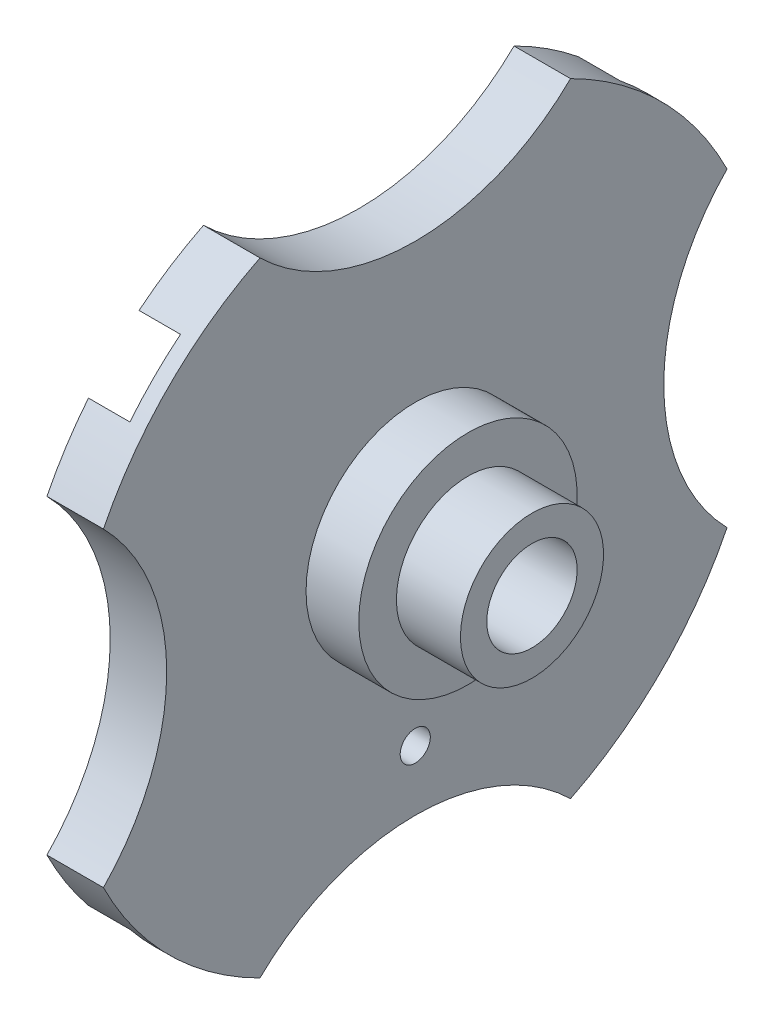
ISO-10303-21;
HEADER;
FILE_DESCRIPTION(('STEP AP214'),'2;1');
FILE_NAME('part.step','',(''),(''),'','','');
FILE_SCHEMA(('AUTOMOTIVE_DESIGN { 1 0 10303 214 1 1 1 1 }'));
ENDSEC;
DATA;
#1=APPLICATION_CONTEXT('core data for automotive mechanical design processes');
#2=APPLICATION_PROTOCOL_DEFINITION('international standard','automotive_design',2000,#1);
#3=PRODUCT_CONTEXT('',#1,'mechanical');
#4=PRODUCT('Part','Part','',(#3));
#5=PRODUCT_RELATED_PRODUCT_CATEGORY('part','',(#4));
#6=PRODUCT_DEFINITION_FORMATION('','',#4);
#7=PRODUCT_DEFINITION_CONTEXT('part definition',#1,'design');
#8=PRODUCT_DEFINITION('design','',#6,#7);
#9=PRODUCT_DEFINITION_SHAPE('','',#8);
#10=(LENGTH_UNIT() NAMED_UNIT(*) SI_UNIT(.MILLI.,.METRE.));
#11=(NAMED_UNIT(*) PLANE_ANGLE_UNIT() SI_UNIT($,.RADIAN.));
#12=(NAMED_UNIT(*) SI_UNIT($,.STERADIAN.) SOLID_ANGLE_UNIT());
#13=UNCERTAINTY_MEASURE_WITH_UNIT(LENGTH_MEASURE(1.E-05),#10,'distance_accuracy_value','');
#14=(GEOMETRIC_REPRESENTATION_CONTEXT(3) GLOBAL_UNCERTAINTY_ASSIGNED_CONTEXT((#13)) GLOBAL_UNIT_ASSIGNED_CONTEXT((#10,
#11,#12)) REPRESENTATION_CONTEXT('',''));
#15=CARTESIAN_POINT('',(0.,0.,0.));
#16=DIRECTION('',(0.,0.,1.));
#17=DIRECTION('',(1.,0.,0.));
#18=AXIS2_PLACEMENT_3D('',#15,#16,#17);
#19=CARTESIAN_POINT('',(0.,0.,0.));
#20=DIRECTION('',(-1.,0.,0.));
#21=DIRECTION('',(0.,0.,1.));
#22=AXIS2_PLACEMENT_3D('',#19,#20,#21);
#23=CYLINDRICAL_SURFACE('',#22,92.5);
#24=CARTESIAN_POINT('',(11.,0.,0.));
#25=DIRECTION('',(-1.,0.,0.));
#26=DIRECTION('',(0.,0.,1.));
#27=AXIS2_PLACEMENT_3D('',#24,#25,#26);
#28=CIRCLE('',#27,92.5);
#29=CARTESIAN_POINT('',(11.,-58.3439949371823,-71.779023779723));
#30=VERTEX_POINT('',#29);
#31=CARTESIAN_POINT('',(11.,-71.7790237797263,-58.3439949371783));
#32=VERTEX_POINT('',#31);
#33=EDGE_CURVE('E200',#30,#32,#28,.T.);
#34=ORIENTED_EDGE('',*,*,#33,.F.);
#35=DIRECTION('',(-1.,0.,0.));
#36=VECTOR('',#35,1.);
#37=CARTESIAN_POINT('',(0.,-58.3439949371823,-71.779023779723));
#38=LINE('',#37,#36);
#39=CARTESIAN_POINT('',(0.,-58.3439949371823,-71.779023779723));
#40=VERTEX_POINT('',#39);
#41=EDGE_CURVE('E251',#30,#40,#38,.T.);
#42=ORIENTED_EDGE('',*,*,#41,.T.);
#43=CARTESIAN_POINT('',(0.,0.,0.));
#44=DIRECTION('',(-1.,0.,0.));
#45=DIRECTION('',(0.,0.,1.));
#46=AXIS2_PLACEMENT_3D('',#43,#44,#45);
#47=CIRCLE('',#46,92.5);
#48=CARTESIAN_POINT('',(0.,-41.2340199228735,-82.8010000000004));
#49=VERTEX_POINT('',#48);
#50=EDGE_CURVE('E408',#49,#40,#47,.T.);
#51=ORIENTED_EDGE('',*,*,#50,.F.);
#52=DIRECTION('',(-1.,0.,0.));
#53=VECTOR('',#52,1.);
#54=CARTESIAN_POINT('',(23.,-41.2340199228735,-82.8010000000004));
#55=LINE('',#54,#53);
#56=CARTESIAN_POINT('',(15.,-41.2340199228735,-82.8010000000004));
#57=VERTEX_POINT('',#56);
#58=EDGE_CURVE('E313',#49,#57,#55,.F.);
#59=ORIENTED_EDGE('',*,*,#58,.T.);
#60=CARTESIAN_POINT('',(15.,0.,0.));
#61=DIRECTION('',(-1.,0.,0.));
#62=DIRECTION('',(0.,0.,1.));
#63=AXIS2_PLACEMENT_3D('',#60,#61,#62);
#64=CIRCLE('',#63,92.5);
#65=CARTESIAN_POINT('',(15.,-82.8009999999997,-41.2340199228749));
#66=VERTEX_POINT('',#65);
#67=EDGE_CURVE('E386',#57,#66,#64,.T.);
#68=ORIENTED_EDGE('',*,*,#67,.T.);
#69=DIRECTION('',(-1.,0.,0.));
#70=VECTOR('',#69,1.);
#71=CARTESIAN_POINT('',(23.,-82.8009999999997,-41.2340199228749));
#72=LINE('',#71,#70);
#73=CARTESIAN_POINT('',(0.,-82.8009999999997,-41.2340199228749));
#74=VERTEX_POINT('',#73);
#75=EDGE_CURVE('E322',#66,#74,#72,.T.);
#76=ORIENTED_EDGE('',*,*,#75,.T.);
#77=CARTESIAN_POINT('',(0.,-71.7790237797263,-58.3439949371783));
#78=VERTEX_POINT('',#77);
#79=EDGE_CURVE('E405',#78,#74,#47,.T.);
#80=ORIENTED_EDGE('',*,*,#79,.F.);
#81=DIRECTION('',(-1.,0.,0.));
#82=VECTOR('',#81,1.);
#83=CARTESIAN_POINT('',(0.,-71.7790237797263,-58.3439949371783));
#84=LINE('',#83,#82);
#85=EDGE_CURVE('E56',#78,#32,#84,.F.);
#86=ORIENTED_EDGE('',*,*,#85,.T.);
#87=EDGE_LOOP('',(#34,#42,#51,#59,#68,#76,#80,#86));
#88=FACE_BOUND('',#87,.T.);
#89=ADVANCED_FACE('F33',(#88),#23,.T.);
#90=CARTESIAN_POINT('',(11.,0.,0.));
#91=DIRECTION('',(-1.,0.,0.));
#92=DIRECTION('',(0.,0.,1.));
#93=AXIS2_PLACEMENT_3D('',#90,#91,#92);
#94=CIRCLE('',#93,92.5);
#95=CARTESIAN_POINT('',(11.,-71.7803426631613,58.3423723134323));
#96=VERTEX_POINT('',#95);
#97=CARTESIAN_POINT('',(11.,-58.3456175273266,71.7777048626864));
#98=VERTEX_POINT('',#97);
#99=EDGE_CURVE('E392',#96,#98,#94,.T.);
#100=ORIENTED_EDGE('',*,*,#99,.F.);
#101=DIRECTION('',(-1.,0.,0.));
#102=VECTOR('',#101,1.);
#103=CARTESIAN_POINT('',(0.,-71.7803426631613,58.3423723134323));
#104=LINE('',#103,#102);
#105=CARTESIAN_POINT('',(0.,-71.7803426631613,58.3423723134323));
#106=VERTEX_POINT('',#105);
#107=EDGE_CURVE('E275',#96,#106,#104,.T.);
#108=ORIENTED_EDGE('',*,*,#107,.T.);
#109=CARTESIAN_POINT('',(0.,-82.8010000000003,41.2340199228738));
#110=VERTEX_POINT('',#109);
#111=EDGE_CURVE('E409',#110,#106,#47,.T.);
#112=ORIENTED_EDGE('',*,*,#111,.F.);
#113=DIRECTION('',(-1.,0.,0.));
#114=VECTOR('',#113,1.);
#115=CARTESIAN_POINT('',(23.,-82.8010000000003,41.2340199228738));
#116=LINE('',#115,#114);
#117=CARTESIAN_POINT('',(15.,-82.8010000000003,41.2340199228738));
#118=VERTEX_POINT('',#117);
#119=EDGE_CURVE('E325',#110,#118,#116,.F.);
#120=ORIENTED_EDGE('',*,*,#119,.T.);
#121=CARTESIAN_POINT('',(15.,-41.2340199228747,82.8009999999998));
#122=VERTEX_POINT('',#121);
#123=EDGE_CURVE('E480',#118,#122,#64,.T.);
#124=ORIENTED_EDGE('',*,*,#123,.T.);
#125=DIRECTION('',(-1.,0.,0.));
#126=VECTOR('',#125,1.);
#127=CARTESIAN_POINT('',(23.,-41.2340199228747,82.8009999999998));
#128=LINE('',#127,#126);
#129=CARTESIAN_POINT('',(0.,-41.2340199228747,82.8009999999998));
#130=VERTEX_POINT('',#129);
#131=EDGE_CURVE('E334',#122,#130,#128,.T.);
#132=ORIENTED_EDGE('',*,*,#131,.T.);
#133=CARTESIAN_POINT('',(0.,-58.3456175273266,71.7777048626864));
#134=VERTEX_POINT('',#133);
#135=EDGE_CURVE('E410',#134,#130,#47,.T.);
#136=ORIENTED_EDGE('',*,*,#135,.F.);
#137=DIRECTION('',(-1.,0.,0.));
#138=VECTOR('',#137,1.);
#139=CARTESIAN_POINT('',(0.,-58.3456175273266,71.7777048626864));
#140=LINE('',#139,#138);
#141=EDGE_CURVE('E270',#134,#98,#140,.F.);
#142=ORIENTED_EDGE('',*,*,#141,.T.);
#143=EDGE_LOOP('',(#100,#108,#112,#120,#124,#132,#136,#142));
#144=FACE_BOUND('',#143,.T.);
#145=ADVANCED_FACE('F445',(#144),#23,.T.);
#146=CARTESIAN_POINT('',(11.,0.,0.));
#147=DIRECTION('',(-1.,0.,0.));
#148=DIRECTION('',(0.,0.,1.));
#149=AXIS2_PLACEMENT_3D('',#146,#147,#148);
#150=CIRCLE('',#149,92.5);
#151=CARTESIAN_POINT('',(11.,58.3439949371803,71.7790237797247));
#152=VERTEX_POINT('',#151);
#153=CARTESIAN_POINT('',(11.,71.7790237797247,58.3439949371803));
#154=VERTEX_POINT('',#153);
#155=EDGE_CURVE('E286',#152,#154,#150,.T.);
#156=ORIENTED_EDGE('',*,*,#155,.F.);
#157=DIRECTION('',(-1.,0.,0.));
#158=VECTOR('',#157,1.);
#159=CARTESIAN_POINT('',(11.,58.3439949371803,71.7790237797247));
#160=LINE('',#159,#158);
#161=CARTESIAN_POINT('',(0.,58.3439949371803,71.7790237797247));
#162=VERTEX_POINT('',#161);
#163=EDGE_CURVE('E299',#152,#162,#160,.T.);
#164=ORIENTED_EDGE('',*,*,#163,.T.);
#165=CARTESIAN_POINT('',(0.,41.2340199228741,82.8010000000001));
#166=VERTEX_POINT('',#165);
#167=EDGE_CURVE('E357',#166,#162,#47,.T.);
#168=ORIENTED_EDGE('',*,*,#167,.F.);
#169=DIRECTION('',(-1.,0.,0.));
#170=VECTOR('',#169,1.);
#171=CARTESIAN_POINT('',(23.,41.2340199228741,82.8010000000001));
#172=LINE('',#171,#170);
#173=CARTESIAN_POINT('',(15.,41.2340199228741,82.8010000000001));
#174=VERTEX_POINT('',#173);
#175=EDGE_CURVE('E337',#166,#174,#172,.F.);
#176=ORIENTED_EDGE('',*,*,#175,.T.);
#177=CARTESIAN_POINT('',(15.,82.801,41.2340199228744));
#178=VERTEX_POINT('',#177);
#179=EDGE_CURVE('E381',#174,#178,#64,.T.);
#180=ORIENTED_EDGE('',*,*,#179,.T.);
#181=DIRECTION('',(-1.,0.,0.));
#182=VECTOR('',#181,1.);
#183=CARTESIAN_POINT('',(23.,82.801,41.2340199228744));
#184=LINE('',#183,#182);
#185=CARTESIAN_POINT('',(0.,82.801,41.2340199228744));
#186=VERTEX_POINT('',#185);
#187=EDGE_CURVE('E346',#178,#186,#184,.T.);
#188=ORIENTED_EDGE('',*,*,#187,.T.);
#189=CARTESIAN_POINT('',(0.,71.7790237797247,58.3439949371803));
#190=VERTEX_POINT('',#189);
#191=EDGE_CURVE('E352',#190,#186,#47,.T.);
#192=ORIENTED_EDGE('',*,*,#191,.F.);
#193=DIRECTION('',(-1.,0.,0.));
#194=VECTOR('',#193,1.);
#195=CARTESIAN_POINT('',(11.,71.7790237797247,58.3439949371803));
#196=LINE('',#195,#194);
#197=EDGE_CURVE('E298',#154,#190,#196,.T.);
#198=ORIENTED_EDGE('',*,*,#197,.F.);
#199=EDGE_LOOP('',(#156,#164,#168,#176,#180,#188,#192,#198));
#200=FACE_BOUND('',#199,.T.);
#201=ADVANCED_FACE('F449',(#200),#23,.T.);
#202=CARTESIAN_POINT('',(11.,0.,0.));
#203=DIRECTION('',(-1.,0.,0.));
#204=DIRECTION('',(0.,0.,1.));
#205=AXIS2_PLACEMENT_3D('',#202,#203,#204);
#206=CIRCLE('',#205,92.5);
#207=CARTESIAN_POINT('',(11.,71.7777048626852,-58.3456175273282));
#208=VERTEX_POINT('',#207);
#209=CARTESIAN_POINT('',(11.,58.3423723134308,-71.7803426631625));
#210=VERTEX_POINT('',#209);
#211=EDGE_CURVE('E11',#208,#210,#206,.T.);
#212=ORIENTED_EDGE('',*,*,#211,.F.);
#213=DIRECTION('',(-1.,0.,0.));
#214=VECTOR('',#213,1.);
#215=CARTESIAN_POINT('',(0.,71.7777048626852,-58.3456175273282));
#216=LINE('',#215,#214);
#217=CARTESIAN_POINT('',(0.,71.7777048626852,-58.3456175273281));
#218=VERTEX_POINT('',#217);
#219=EDGE_CURVE('E229',#208,#218,#216,.T.);
#220=ORIENTED_EDGE('',*,*,#219,.T.);
#221=CARTESIAN_POINT('',(0.,82.801,-41.2340199228744));
#222=VERTEX_POINT('',#221);
#223=EDGE_CURVE('E353',#222,#218,#47,.T.);
#224=ORIENTED_EDGE('',*,*,#223,.F.);
#225=DIRECTION('',(-1.,0.,0.));
#226=VECTOR('',#225,1.);
#227=CARTESIAN_POINT('',(23.,82.801,-41.2340199228744));
#228=LINE('',#227,#226);
#229=CARTESIAN_POINT('',(15.,82.801,-41.2340199228744));
#230=VERTEX_POINT('',#229);
#231=EDGE_CURVE('E349',#222,#230,#228,.F.);
#232=ORIENTED_EDGE('',*,*,#231,.T.);
#233=CARTESIAN_POINT('',(15.,41.2340199228752,-82.8009999999996));
#234=VERTEX_POINT('',#233);
#235=EDGE_CURVE('E382',#230,#234,#64,.T.);
#236=ORIENTED_EDGE('',*,*,#235,.T.);
#237=DIRECTION('',(-1.,0.,0.));
#238=VECTOR('',#237,1.);
#239=CARTESIAN_POINT('',(23.,41.2340199228752,-82.8009999999996));
#240=LINE('',#239,#238);
#241=CARTESIAN_POINT('',(0.,41.2340199228752,-82.8009999999996));
#242=VERTEX_POINT('',#241);
#243=EDGE_CURVE('E310',#234,#242,#240,.T.);
#244=ORIENTED_EDGE('',*,*,#243,.T.);
#245=CARTESIAN_POINT('',(0.,58.3423723134308,-71.7803426631625));
#246=VERTEX_POINT('',#245);
#247=EDGE_CURVE('E356',#246,#242,#47,.T.);
#248=ORIENTED_EDGE('',*,*,#247,.F.);
#249=DIRECTION('',(-1.,0.,0.));
#250=VECTOR('',#249,1.);
#251=CARTESIAN_POINT('',(0.,58.3423723134308,-71.7803426631625));
#252=LINE('',#251,#250);
#253=EDGE_CURVE('E48',#246,#210,#252,.F.);
#254=ORIENTED_EDGE('',*,*,#253,.T.);
#255=EDGE_LOOP('',(#212,#220,#224,#232,#236,#244,#248,#254));
#256=FACE_BOUND('',#255,.T.);
#257=ADVANCED_FACE('F35',(#256),#23,.T.);
#258=CARTESIAN_POINT('',(15.,92.5,0.));
#259=DIRECTION('',(-1.,0.,0.));
#260=DIRECTION('',(0.,0.,1.));
#261=AXIS2_PLACEMENT_3D('',#258,#259,#260);
#262=PLANE('',#261);
#263=CARTESIAN_POINT('',(15.,-50.,0.));
#264=DIRECTION('',(-1.,0.,0.));
#265=DIRECTION('',(0.,0.,1.));
#266=AXIS2_PLACEMENT_3D('',#263,#264,#265);
#267=CIRCLE('',#266,4.00000000000001);
#268=CARTESIAN_POINT('',(15.,-50.,4.00000000000001));
#269=VERTEX_POINT('',#268);
#270=EDGE_CURVE('E214',#269,#269,#267,.T.);
#271=ORIENTED_EDGE('',*,*,#270,.T.);
#272=EDGE_LOOP('',(#271));
#273=FACE_BOUND('',#272,.T.);
#274=ORIENTED_EDGE('',*,*,#67,.F.);
#275=CARTESIAN_POINT('',(15.,1.30930626041602E-12,-125.));
#276=DIRECTION('',(-1.,0.,0.));
#277=DIRECTION('',(0.,0.,1.));
#278=AXIS2_PLACEMENT_3D('',#275,#276,#277);
#279=CIRCLE('',#278,59.);
#280=EDGE_CURVE('E302',#57,#234,#279,.T.);
#281=ORIENTED_EDGE('',*,*,#280,.T.);
#282=ORIENTED_EDGE('',*,*,#235,.F.);
#283=CARTESIAN_POINT('',(15.,125.,0.));
#284=DIRECTION('',(-1.,0.,0.));
#285=DIRECTION('',(0.,0.,1.));
#286=AXIS2_PLACEMENT_3D('',#283,#284,#285);
#287=CIRCLE('',#286,59.);
#288=EDGE_CURVE('E343',#230,#178,#287,.T.);
#289=ORIENTED_EDGE('',*,*,#288,.T.);
#290=ORIENTED_EDGE('',*,*,#179,.F.);
#291=CARTESIAN_POINT('',(15.,-4.36435420138673E-13,125.));
#292=DIRECTION('',(-1.,0.,0.));
#293=DIRECTION('',(0.,0.,1.));
#294=AXIS2_PLACEMENT_3D('',#291,#292,#293);
#295=CIRCLE('',#294,59.);
#296=EDGE_CURVE('E331',#174,#122,#295,.T.);
#297=ORIENTED_EDGE('',*,*,#296,.T.);
#298=ORIENTED_EDGE('',*,*,#123,.F.);
#299=CARTESIAN_POINT('',(15.,-125.,-8.72870840277346E-13));
#300=DIRECTION('',(-1.,0.,0.));
#301=DIRECTION('',(0.,0.,1.));
#302=AXIS2_PLACEMENT_3D('',#299,#300,#301);
#303=CIRCLE('',#302,59.);
#304=EDGE_CURVE('E319',#118,#66,#303,.T.);
#305=ORIENTED_EDGE('',*,*,#304,.T.);
#306=EDGE_LOOP('',(#274,#281,#282,#289,#290,#297,#298,#305));
#307=FACE_BOUND('',#306,.T.);
#308=CARTESIAN_POINT('',(15.,0.,0.));
#309=DIRECTION('',(-1.,0.,0.));
#310=DIRECTION('',(0.,0.,1.));
#311=AXIS2_PLACEMENT_3D('',#308,#309,#310);
#312=CIRCLE('',#311,29.);
#313=CARTESIAN_POINT('',(15.,0.,29.));
#314=VERTEX_POINT('',#313);
#315=EDGE_CURVE('E378',#314,#314,#312,.T.);
#316=ORIENTED_EDGE('',*,*,#315,.T.);
#317=EDGE_LOOP('',(#316));
#318=FACE_BOUND('',#317,.T.);
#319=ADVANCED_FACE('F423',(#273,#307,#318),#262,.F.);
#320=CARTESIAN_POINT('',(0.,0.,0.));
#321=DIRECTION('',(-1.,0.,0.));
#322=DIRECTION('',(0.,0.,1.));
#323=AXIS2_PLACEMENT_3D('',#320,#321,#322);
#324=CYLINDRICAL_SURFACE('',#323,29.);
#325=ORIENTED_EDGE('',*,*,#315,.F.);
#326=EDGE_LOOP('',(#325));
#327=FACE_BOUND('',#326,.T.);
#328=CARTESIAN_POINT('',(29.,0.,0.));
#329=DIRECTION('',(-1.,0.,0.));
#330=DIRECTION('',(0.,0.,1.));
#331=AXIS2_PLACEMENT_3D('',#328,#329,#330);
#332=CIRCLE('',#331,29.);
#333=CARTESIAN_POINT('',(29.,0.,29.));
#334=VERTEX_POINT('',#333);
#335=EDGE_CURVE('E375',#334,#334,#332,.T.);
#336=ORIENTED_EDGE('',*,*,#335,.T.);
#337=EDGE_LOOP('',(#336));
#338=FACE_BOUND('',#337,.T.);
#339=ADVANCED_FACE('F456',(#327,#338),#324,.T.);
#340=CARTESIAN_POINT('',(29.,29.,0.));
#341=DIRECTION('',(-1.,0.,0.));
#342=DIRECTION('',(0.,0.,1.));
#343=AXIS2_PLACEMENT_3D('',#340,#341,#342);
#344=PLANE('',#343);
#345=ORIENTED_EDGE('',*,*,#335,.F.);
#346=EDGE_LOOP('',(#345));
#347=FACE_BOUND('',#346,.T.);
#348=CARTESIAN_POINT('',(29.,0.,0.));
#349=DIRECTION('',(-1.,0.,0.));
#350=DIRECTION('',(0.,0.,1.));
#351=AXIS2_PLACEMENT_3D('',#348,#349,#350);
#352=CIRCLE('',#351,19.);
#353=CARTESIAN_POINT('',(29.,0.,19.));
#354=VERTEX_POINT('',#353);
#355=EDGE_CURVE('E372',#354,#354,#352,.T.);
#356=ORIENTED_EDGE('',*,*,#355,.T.);
#357=EDGE_LOOP('',(#356));
#358=FACE_BOUND('',#357,.T.);
#359=ADVANCED_FACE('F522',(#347,#358),#344,.F.);
#360=CARTESIAN_POINT('',(0.,0.,0.));
#361=DIRECTION('',(-1.,0.,0.));
#362=DIRECTION('',(0.,0.,1.));
#363=AXIS2_PLACEMENT_3D('',#360,#361,#362);
#364=CYLINDRICAL_SURFACE('',#363,19.);
#365=ORIENTED_EDGE('',*,*,#355,.F.);
#366=EDGE_LOOP('',(#365));
#367=FACE_BOUND('',#366,.T.);
#368=CARTESIAN_POINT('',(46.,0.,0.));
#369=DIRECTION('',(-1.,0.,0.));
#370=DIRECTION('',(0.,0.,1.));
#371=AXIS2_PLACEMENT_3D('',#368,#369,#370);
#372=CIRCLE('',#371,19.);
#373=CARTESIAN_POINT('',(46.,0.,19.));
#374=VERTEX_POINT('',#373);
#375=EDGE_CURVE('E369',#374,#374,#372,.T.);
#376=ORIENTED_EDGE('',*,*,#375,.T.);
#377=EDGE_LOOP('',(#376));
#378=FACE_BOUND('',#377,.T.);
#379=ADVANCED_FACE('F518',(#367,#378),#364,.T.);
#380=CARTESIAN_POINT('',(46.,19.,0.));
#381=DIRECTION('',(-1.,0.,0.));
#382=DIRECTION('',(0.,0.,1.));
#383=AXIS2_PLACEMENT_3D('',#380,#381,#382);
#384=PLANE('',#383);
#385=ORIENTED_EDGE('',*,*,#375,.F.);
#386=EDGE_LOOP('',(#385));
#387=FACE_BOUND('',#386,.T.);
#388=CARTESIAN_POINT('',(46.,0.,0.));
#389=DIRECTION('',(-1.,0.,0.));
#390=DIRECTION('',(0.,0.,1.));
#391=AXIS2_PLACEMENT_3D('',#388,#389,#390);
#392=CIRCLE('',#391,12.);
#393=CARTESIAN_POINT('',(46.,0.,12.));
#394=VERTEX_POINT('',#393);
#395=EDGE_CURVE('E366',#394,#394,#392,.T.);
#396=ORIENTED_EDGE('',*,*,#395,.T.);
#397=EDGE_LOOP('',(#396));
#398=FACE_BOUND('',#397,.T.);
#399=ADVANCED_FACE('F514',(#387,#398),#384,.F.);
#400=CARTESIAN_POINT('',(0.,0.,0.));
#401=DIRECTION('',(-1.,0.,0.));
#402=DIRECTION('',(0.,0.,1.));
#403=AXIS2_PLACEMENT_3D('',#400,#401,#402);
#404=CYLINDRICAL_SURFACE('',#403,12.);
#405=ORIENTED_EDGE('',*,*,#395,.F.);
#406=EDGE_LOOP('',(#405));
#407=FACE_BOUND('',#406,.T.);
#408=CARTESIAN_POINT('',(17.,0.,0.));
#409=DIRECTION('',(-1.,0.,0.));
#410=DIRECTION('',(0.,0.,1.));
#411=AXIS2_PLACEMENT_3D('',#408,#409,#410);
#412=CIRCLE('',#411,12.);
#413=CARTESIAN_POINT('',(17.,0.,12.));
#414=VERTEX_POINT('',#413);
#415=EDGE_CURVE('E363',#414,#414,#412,.T.);
#416=ORIENTED_EDGE('',*,*,#415,.T.);
#417=EDGE_LOOP('',(#416));
#418=FACE_BOUND('',#417,.T.);
#419=ADVANCED_FACE('F510',(#407,#418),#404,.F.);
#420=CARTESIAN_POINT('',(17.,24.,0.));
#421=DIRECTION('',(1.,0.,0.));
#422=DIRECTION('',(0.,0.,-1.));
#423=AXIS2_PLACEMENT_3D('',#420,#421,#422);
#424=PLANE('',#423);
#425=ORIENTED_EDGE('',*,*,#415,.F.);
#426=EDGE_LOOP('',(#425));
#427=FACE_BOUND('',#426,.T.);
#428=CARTESIAN_POINT('',(17.,0.,0.));
#429=DIRECTION('',(-1.,0.,0.));
#430=DIRECTION('',(0.,0.,1.));
#431=AXIS2_PLACEMENT_3D('',#428,#429,#430);
#432=CIRCLE('',#431,24.);
#433=CARTESIAN_POINT('',(17.,0.,24.));
#434=VERTEX_POINT('',#433);
#435=EDGE_CURVE('E360',#434,#434,#432,.T.);
#436=ORIENTED_EDGE('',*,*,#435,.T.);
#437=EDGE_LOOP('',(#436));
#438=FACE_BOUND('',#437,.T.);
#439=ADVANCED_FACE('F506',(#427,#438),#424,.F.);
#440=CARTESIAN_POINT('',(0.,0.,0.));
#441=DIRECTION('',(-1.,0.,0.));
#442=DIRECTION('',(0.,0.,1.));
#443=AXIS2_PLACEMENT_3D('',#440,#441,#442);
#444=CYLINDRICAL_SURFACE('',#443,24.);
#445=ORIENTED_EDGE('',*,*,#435,.F.);
#446=EDGE_LOOP('',(#445));
#447=FACE_BOUND('',#446,.T.);
#448=CARTESIAN_POINT('',(0.,0.,0.));
#449=DIRECTION('',(-1.,0.,0.));
#450=DIRECTION('',(0.,0.,1.));
#451=AXIS2_PLACEMENT_3D('',#448,#449,#450);
#452=CIRCLE('',#451,24.);
#453=CARTESIAN_POINT('',(0.,0.,24.));
#454=VERTEX_POINT('',#453);
#455=EDGE_CURVE('E355',#454,#454,#452,.T.);
#456=ORIENTED_EDGE('',*,*,#455,.T.);
#457=EDGE_LOOP('',(#456));
#458=FACE_BOUND('',#457,.T.);
#459=ADVANCED_FACE('F502',(#447,#458),#444,.F.);
#460=CARTESIAN_POINT('',(0.,24.,0.));
#461=DIRECTION('',(1.,0.,0.));
#462=DIRECTION('',(0.,0.,-1.));
#463=AXIS2_PLACEMENT_3D('',#460,#461,#462);
#464=PLANE('',#463);
#465=CARTESIAN_POINT('',(0.,-50.,0.));
#466=DIRECTION('',(-1.,0.,0.));
#467=DIRECTION('',(0.,0.,1.));
#468=AXIS2_PLACEMENT_3D('',#465,#466,#467);
#469=CIRCLE('',#468,4.00000000000001);
#470=CARTESIAN_POINT('',(0.,-50.,4.00000000000001));
#471=VERTEX_POINT('',#470);
#472=EDGE_CURVE('E219',#471,#471,#469,.T.);
#473=ORIENTED_EDGE('',*,*,#472,.F.);
#474=EDGE_LOOP('',(#473));
#475=FACE_BOUND('',#474,.T.);
#476=ORIENTED_EDGE('',*,*,#455,.F.);
#477=EDGE_LOOP('',(#476));
#478=FACE_BOUND('',#477,.T.);
#479=ORIENTED_EDGE('',*,*,#223,.T.);
#480=DIRECTION('',(0.,0.70710678118655,-0.707106781186546));
#481=VECTOR('',#480,1.);
#482=CARTESIAN_POINT('',(0.,32.1733585439868,-18.74127120863));
#483=LINE('',#482,#481);
#484=CARTESIAN_POINT('',(0.,32.1733585439868,-18.7412712086299));
#485=VERTEX_POINT('',#484);
#486=EDGE_CURVE('E213',#485,#218,#483,.T.);
#487=ORIENTED_EDGE('',*,*,#486,.F.);
#488=CARTESIAN_POINT('',(0.,25.4558441227146,-25.4587856299022));
#489=DIRECTION('',(-1.,0.,0.));
#490=DIRECTION('',(0.,0.,1.));
#491=AXIS2_PLACEMENT_3D('',#488,#489,#490);
#492=CIRCLE('',#491,9.5);
#493=CARTESIAN_POINT('',(0.,18.7383297014424,-32.1763000511744));
#494=VERTEX_POINT('',#493);
#495=EDGE_CURVE('E204',#494,#485,#492,.T.);
#496=ORIENTED_EDGE('',*,*,#495,.F.);
#497=DIRECTION('',(0.,0.70710678118655,-0.707106781186545));
#498=VECTOR('',#497,1.);
#499=CARTESIAN_POINT('',(0.,5.28101482513402,-18.7189851748661));
#500=LINE('',#499,#498);
#501=EDGE_CURVE('E41',#494,#246,#500,.T.);
#502=ORIENTED_EDGE('',*,*,#501,.T.);
#503=ORIENTED_EDGE('',*,*,#247,.T.);
#504=CARTESIAN_POINT('',(0.,1.30930626041602E-12,-125.));
#505=DIRECTION('',(1.,0.,0.));
#506=DIRECTION('',(0.,0.,-1.));
#507=AXIS2_PLACEMENT_3D('',#504,#505,#506);
#508=CIRCLE('',#507,59.);
#509=EDGE_CURVE('E385',#242,#49,#508,.T.);
#510=ORIENTED_EDGE('',*,*,#509,.T.);
#511=ORIENTED_EDGE('',*,*,#50,.T.);
#512=DIRECTION('',(0.,-0.70710678118656,-0.707106781186535));
#513=VECTOR('',#512,1.);
#514=CARTESIAN_POINT('',(0.,-18.7412712086311,-32.1763000511732));
#515=LINE('',#514,#513);
#516=CARTESIAN_POINT('',(0.,-18.7412712086311,-32.1763000511732));
#517=VERTEX_POINT('',#516);
#518=EDGE_CURVE('E235',#517,#40,#515,.T.);
#519=ORIENTED_EDGE('',*,*,#518,.F.);
#520=CARTESIAN_POINT('',(0.,-25.4587856299033,-25.458785629901));
#521=DIRECTION('',(-1.,0.,0.));
#522=DIRECTION('',(0.,0.,1.));
#523=AXIS2_PLACEMENT_3D('',#520,#521,#522);
#524=CIRCLE('',#523,9.5);
#525=CARTESIAN_POINT('',(0.,-32.1763000511755,-18.7412712086288));
#526=VERTEX_POINT('',#525);
#527=EDGE_CURVE('E232',#526,#517,#524,.T.);
#528=ORIENTED_EDGE('',*,*,#527,.F.);
#529=DIRECTION('',(0.,-0.70710678118656,-0.707106781186535));
#530=VECTOR('',#529,1.);
#531=CARTESIAN_POINT('',(0.,5.28248557872764,18.717514421273));
#532=LINE('',#531,#530);
#533=EDGE_CURVE('E394',#526,#78,#532,.T.);
#534=ORIENTED_EDGE('',*,*,#533,.T.);
#535=ORIENTED_EDGE('',*,*,#79,.T.);
#536=CARTESIAN_POINT('',(0.,-125.,-8.72870840277346E-13));
#537=DIRECTION('',(-1.,0.,0.));
#538=DIRECTION('',(0.,0.,1.));
#539=AXIS2_PLACEMENT_3D('',#536,#537,#538);
#540=CIRCLE('',#539,59.);
#541=EDGE_CURVE('E316',#110,#74,#540,.T.);
#542=ORIENTED_EDGE('',*,*,#541,.F.);
#543=ORIENTED_EDGE('',*,*,#111,.T.);
#544=DIRECTION('',(0.,-0.707106781186541,0.707106781186554));
#545=VECTOR('',#544,1.);
#546=CARTESIAN_POINT('',(0.,-32.1763000511743,18.7383297014447));
#547=LINE('',#546,#545);
#548=CARTESIAN_POINT('',(0.,-32.1763000511743,18.7383297014446));
#549=VERTEX_POINT('',#548);
#550=EDGE_CURVE('E257',#549,#106,#547,.T.);
#551=ORIENTED_EDGE('',*,*,#550,.F.);
#552=CARTESIAN_POINT('',(0.,-25.4587856299021,25.4558441227168));
#553=DIRECTION('',(-1.,0.,0.));
#554=DIRECTION('',(0.,0.,1.));
#555=AXIS2_PLACEMENT_3D('',#552,#553,#554);
#556=CIRCLE('',#555,9.5);
#557=CARTESIAN_POINT('',(0.,-18.7412712086299,32.1733585439891));
#558=VERTEX_POINT('',#557);
#559=EDGE_CURVE('E254',#558,#549,#556,.T.);
#560=ORIENTED_EDGE('',*,*,#559,.F.);
#561=DIRECTION('',(0.,-0.707106781186542,0.707106781186553));
#562=VECTOR('',#561,1.);
#563=CARTESIAN_POINT('',(0.,18.7160436676792,-5.28395633232071));
#564=LINE('',#563,#562);
#565=EDGE_CURVE('E389',#558,#134,#564,.T.);
#566=ORIENTED_EDGE('',*,*,#565,.T.);
#567=ORIENTED_EDGE('',*,*,#135,.T.);
#568=CARTESIAN_POINT('',(0.,-4.36435420138673E-13,125.));
#569=DIRECTION('',(-1.,0.,0.));
#570=DIRECTION('',(0.,0.,1.));
#571=AXIS2_PLACEMENT_3D('',#568,#569,#570);
#572=CIRCLE('',#571,59.);
#573=EDGE_CURVE('E328',#166,#130,#572,.T.);
#574=ORIENTED_EDGE('',*,*,#573,.F.);
#575=ORIENTED_EDGE('',*,*,#167,.T.);
#576=DIRECTION('',(0.,0.707106781186548,0.707106781186547));
#577=VECTOR('',#576,1.);
#578=CARTESIAN_POINT('',(0.,18.7383297014435,32.1733585439879));
#579=LINE('',#578,#577);
#580=CARTESIAN_POINT('',(0.,18.7383297014435,32.1733585439879));
#581=VERTEX_POINT('',#580);
#582=EDGE_CURVE('E284',#581,#162,#579,.T.);
#583=ORIENTED_EDGE('',*,*,#582,.F.);
#584=CARTESIAN_POINT('',(0.,25.4558441227157,25.4558441227157));
#585=DIRECTION('',(-1.,0.,0.));
#586=DIRECTION('',(0.,0.,1.));
#587=AXIS2_PLACEMENT_3D('',#584,#585,#586);
#588=CIRCLE('',#587,9.5);
#589=CARTESIAN_POINT('',(0.,32.1733585439879,18.7383297014435));
#590=VERTEX_POINT('',#589);
#591=EDGE_CURVE('E281',#590,#581,#588,.T.);
#592=ORIENTED_EDGE('',*,*,#591,.F.);
#593=DIRECTION('',(0.,-0.707106781186547,-0.707106781186548));
#594=VECTOR('',#593,1.);
#595=CARTESIAN_POINT('',(0.,32.1733585439879,18.7383297014435));
#596=LINE('',#595,#594);
#597=EDGE_CURVE('E278',#190,#590,#596,.T.);
#598=ORIENTED_EDGE('',*,*,#597,.F.);
#599=ORIENTED_EDGE('',*,*,#191,.T.);
#600=CARTESIAN_POINT('',(0.,125.,0.));
#601=DIRECTION('',(-1.,0.,0.));
#602=DIRECTION('',(0.,0.,1.));
#603=AXIS2_PLACEMENT_3D('',#600,#601,#602);
#604=CIRCLE('',#603,59.);
#605=EDGE_CURVE('E340',#222,#186,#604,.T.);
#606=ORIENTED_EDGE('',*,*,#605,.F.);
#607=EDGE_LOOP('',(#479,#487,#496,#502,#503,#510,#511,#519,#528,#534,#535,#542,#543,#551,#560,
#566,#567,#574,#575,#583,#592,#598,#599,#606));
#608=FACE_BOUND('',#607,.T.);
#609=ADVANCED_FACE('F212',(#475,#478,#608),#464,.F.);
#610=CARTESIAN_POINT('',(46.,125.,0.));
#611=DIRECTION('',(-1.,0.,0.));
#612=DIRECTION('',(0.,0.,1.));
#613=AXIS2_PLACEMENT_3D('',#610,#611,#612);
#614=CYLINDRICAL_SURFACE('',#613,59.);
#615=ORIENTED_EDGE('',*,*,#605,.T.);
#616=ORIENTED_EDGE('',*,*,#187,.F.);
#617=ORIENTED_EDGE('',*,*,#288,.F.);
#618=ORIENTED_EDGE('',*,*,#231,.F.);
#619=EDGE_LOOP('',(#615,#616,#617,#618));
#620=FACE_BOUND('',#619,.T.);
#621=ADVANCED_FACE('F479',(#620),#614,.F.);
#622=CARTESIAN_POINT('',(46.,-4.36435420138673E-13,125.));
#623=DIRECTION('',(-1.,0.,0.));
#624=DIRECTION('',(0.,0.,1.));
#625=AXIS2_PLACEMENT_3D('',#622,#623,#624);
#626=CYLINDRICAL_SURFACE('',#625,59.);
#627=ORIENTED_EDGE('',*,*,#573,.T.);
#628=ORIENTED_EDGE('',*,*,#131,.F.);
#629=ORIENTED_EDGE('',*,*,#296,.F.);
#630=ORIENTED_EDGE('',*,*,#175,.F.);
#631=EDGE_LOOP('',(#627,#628,#629,#630));
#632=FACE_BOUND('',#631,.T.);
#633=ADVANCED_FACE('F487',(#632),#626,.F.);
#634=CARTESIAN_POINT('',(46.,-125.,-8.72870840277346E-13));
#635=DIRECTION('',(-1.,0.,0.));
#636=DIRECTION('',(0.,0.,1.));
#637=AXIS2_PLACEMENT_3D('',#634,#635,#636);
#638=CYLINDRICAL_SURFACE('',#637,59.);
#639=ORIENTED_EDGE('',*,*,#541,.T.);
#640=ORIENTED_EDGE('',*,*,#75,.F.);
#641=ORIENTED_EDGE('',*,*,#304,.F.);
#642=ORIENTED_EDGE('',*,*,#119,.F.);
#643=EDGE_LOOP('',(#639,#640,#641,#642));
#644=FACE_BOUND('',#643,.T.);
#645=ADVANCED_FACE('F489',(#644),#638,.F.);
#646=CARTESIAN_POINT('',(46.,1.30930626041602E-12,-125.));
#647=DIRECTION('',(-1.,0.,0.));
#648=DIRECTION('',(0.,0.,1.));
#649=AXIS2_PLACEMENT_3D('',#646,#647,#648);
#650=CYLINDRICAL_SURFACE('',#649,59.);
#651=ORIENTED_EDGE('',*,*,#509,.F.);
#652=ORIENTED_EDGE('',*,*,#243,.F.);
#653=ORIENTED_EDGE('',*,*,#280,.F.);
#654=ORIENTED_EDGE('',*,*,#58,.F.);
#655=EDGE_LOOP('',(#651,#652,#653,#654));
#656=FACE_BOUND('',#655,.T.);
#657=ADVANCED_FACE('F417',(#656),#650,.F.);
#658=CARTESIAN_POINT('',(11.,18.7383297014435,32.1733585439879));
#659=DIRECTION('',(0.,-0.707106781186547,0.707106781186548));
#660=DIRECTION('',(0.,-0.707106781186548,-0.707106781186547));
#661=AXIS2_PLACEMENT_3D('',#658,#659,#660);
#662=PLANE('',#661);
#663=ORIENTED_EDGE('',*,*,#582,.T.);
#664=ORIENTED_EDGE('',*,*,#163,.F.);
#665=DIRECTION('',(0.,0.707106781186548,0.707106781186547));
#666=VECTOR('',#665,1.);
#667=CARTESIAN_POINT('',(11.,18.7383297014435,32.1733585439879));
#668=LINE('',#667,#666);
#669=CARTESIAN_POINT('',(11.,18.7383297014435,32.1733585439879));
#670=VERTEX_POINT('',#669);
#671=EDGE_CURVE('E295',#670,#152,#668,.T.);
#672=ORIENTED_EDGE('',*,*,#671,.F.);
#673=DIRECTION('',(-1.,0.,0.));
#674=VECTOR('',#673,1.);
#675=CARTESIAN_POINT('',(11.,18.7383297014435,32.1733585439879));
#676=LINE('',#675,#674);
#677=EDGE_CURVE('E303',#670,#581,#676,.T.);
#678=ORIENTED_EDGE('',*,*,#677,.T.);
#679=EDGE_LOOP('',(#663,#664,#672,#678));
#680=FACE_BOUND('',#679,.T.);
#681=ADVANCED_FACE('F471',(#680),#662,.F.);
#682=CARTESIAN_POINT('',(11.,25.4558441227157,25.4558441227157));
#683=DIRECTION('',(-1.,0.,0.));
#684=DIRECTION('',(0.,0.,1.));
#685=AXIS2_PLACEMENT_3D('',#682,#683,#684);
#686=CYLINDRICAL_SURFACE('',#685,9.5);
#687=ORIENTED_EDGE('',*,*,#591,.T.);
#688=ORIENTED_EDGE('',*,*,#677,.F.);
#689=CARTESIAN_POINT('',(11.,25.4558441227157,25.4558441227157));
#690=DIRECTION('',(-1.,0.,0.));
#691=DIRECTION('',(0.,0.,1.));
#692=AXIS2_PLACEMENT_3D('',#689,#690,#691);
#693=CIRCLE('',#692,9.5);
#694=CARTESIAN_POINT('',(11.,32.1733585439879,18.7383297014435));
#695=VERTEX_POINT('',#694);
#696=EDGE_CURVE('E292',#695,#670,#693,.T.);
#697=ORIENTED_EDGE('',*,*,#696,.F.);
#698=DIRECTION('',(-1.,0.,0.));
#699=VECTOR('',#698,1.);
#700=CARTESIAN_POINT('',(11.,32.1733585439879,18.7383297014435));
#701=LINE('',#700,#699);
#702=EDGE_CURVE('E305',#695,#590,#701,.T.);
#703=ORIENTED_EDGE('',*,*,#702,.T.);
#704=EDGE_LOOP('',(#687,#688,#697,#703));
#705=FACE_BOUND('',#704,.T.);
#706=ADVANCED_FACE('F608',(#705),#686,.F.);
#707=CARTESIAN_POINT('',(11.,32.1733585439879,18.7383297014435));
#708=DIRECTION('',(0.,0.707106781186548,-0.707106781186547));
#709=DIRECTION('',(0.,0.707106781186547,0.707106781186548));
#710=AXIS2_PLACEMENT_3D('',#707,#708,#709);
#711=PLANE('',#710);
#712=ORIENTED_EDGE('',*,*,#597,.T.);
#713=ORIENTED_EDGE('',*,*,#702,.F.);
#714=DIRECTION('',(0.,-0.707106781186547,-0.707106781186548));
#715=VECTOR('',#714,1.);
#716=CARTESIAN_POINT('',(11.,32.1733585439879,18.7383297014435));
#717=LINE('',#716,#715);
#718=EDGE_CURVE('E289',#154,#695,#717,.T.);
#719=ORIENTED_EDGE('',*,*,#718,.F.);
#720=ORIENTED_EDGE('',*,*,#197,.T.);
#721=EDGE_LOOP('',(#712,#713,#719,#720));
#722=FACE_BOUND('',#721,.T.);
#723=ADVANCED_FACE('F617',(#722),#711,.F.);
#724=CARTESIAN_POINT('',(11.,0.,0.));
#725=DIRECTION('',(-1.,0.,0.));
#726=DIRECTION('',(0.,0.,1.));
#727=AXIS2_PLACEMENT_3D('',#724,#725,#726);
#728=PLANE('',#727);
#729=ORIENTED_EDGE('',*,*,#155,.T.);
#730=ORIENTED_EDGE('',*,*,#718,.T.);
#731=ORIENTED_EDGE('',*,*,#696,.T.);
#732=ORIENTED_EDGE('',*,*,#671,.T.);
#733=EDGE_LOOP('',(#729,#730,#731,#732));
#734=FACE_BOUND('',#733,.T.);
#735=ADVANCED_FACE('F467',(#734),#728,.T.);
#736=CARTESIAN_POINT('',(11.,-0.00294150718643395,2.27595720048157E-12));
#737=DIRECTION('',(-1.,0.,0.));
#738=DIRECTION('',(0.,0.,1.));
#739=AXIS2_PLACEMENT_3D('',#736,#737,#738);
#740=PLANE('',#739);
#741=ORIENTED_EDGE('',*,*,#99,.T.);
#742=DIRECTION('',(0.,0.707106781186542,-0.707106781186553));
#743=VECTOR('',#742,1.);
#744=CARTESIAN_POINT('',(11.,-18.7412712086299,32.1733585439891));
#745=LINE('',#744,#743);
#746=CARTESIAN_POINT('',(11.,-18.7412712086299,32.1733585439891));
#747=VERTEX_POINT('',#746);
#748=EDGE_CURVE('E259',#98,#747,#745,.T.);
#749=ORIENTED_EDGE('',*,*,#748,.T.);
#750=CARTESIAN_POINT('',(11.,-25.4587856299021,25.4558441227168));
#751=DIRECTION('',(-1.,0.,0.));
#752=DIRECTION('',(0.,0.,1.));
#753=AXIS2_PLACEMENT_3D('',#750,#751,#752);
#754=CIRCLE('',#753,9.5);
#755=CARTESIAN_POINT('',(11.,-32.1763000511743,18.7383297014446));
#756=VERTEX_POINT('',#755);
#757=EDGE_CURVE('E261',#747,#756,#754,.T.);
#758=ORIENTED_EDGE('',*,*,#757,.T.);
#759=DIRECTION('',(0.,-0.707106781186541,0.707106781186554));
#760=VECTOR('',#759,1.);
#761=CARTESIAN_POINT('',(11.,-32.1763000511743,18.7383297014447));
#762=LINE('',#761,#760);
#763=EDGE_CURVE('E264',#756,#96,#762,.T.);
#764=ORIENTED_EDGE('',*,*,#763,.T.);
#765=EDGE_LOOP('',(#741,#749,#758,#764));
#766=FACE_BOUND('',#765,.T.);
#767=ADVANCED_FACE('F636',(#766),#740,.T.);
#768=CARTESIAN_POINT('',(11.,-32.1763000511743,18.7383297014447));
#769=DIRECTION('',(0.,-0.707106781186554,-0.707106781186541));
#770=DIRECTION('',(0.,0.707106781186541,-0.707106781186554));
#771=AXIS2_PLACEMENT_3D('',#768,#769,#770);
#772=PLANE('',#771);
#773=ORIENTED_EDGE('',*,*,#763,.F.);
#774=DIRECTION('',(-1.,0.,0.));
#775=VECTOR('',#774,1.);
#776=CARTESIAN_POINT('',(11.,-32.1763000511743,18.7383297014446));
#777=LINE('',#776,#775);
#778=EDGE_CURVE('E268',#756,#549,#777,.T.);
#779=ORIENTED_EDGE('',*,*,#778,.T.);
#780=ORIENTED_EDGE('',*,*,#550,.T.);
#781=ORIENTED_EDGE('',*,*,#107,.F.);
#782=EDGE_LOOP('',(#773,#779,#780,#781));
#783=FACE_BOUND('',#782,.T.);
#784=ADVANCED_FACE('F645',(#783),#772,.F.);
#785=CARTESIAN_POINT('',(11.,-18.7412712086299,32.1733585439891));
#786=DIRECTION('',(0.,0.707106781186553,0.707106781186542));
#787=DIRECTION('',(0.,-0.707106781186542,0.707106781186553));
#788=AXIS2_PLACEMENT_3D('',#785,#786,#787);
#789=PLANE('',#788);
#790=ORIENTED_EDGE('',*,*,#565,.F.);
#791=DIRECTION('',(-1.,0.,0.));
#792=VECTOR('',#791,1.);
#793=CARTESIAN_POINT('',(11.,-18.7412712086299,32.1733585439891));
#794=LINE('',#793,#792);
#795=EDGE_CURVE('E267',#747,#558,#794,.T.);
#796=ORIENTED_EDGE('',*,*,#795,.F.);
#797=ORIENTED_EDGE('',*,*,#748,.F.);
#798=ORIENTED_EDGE('',*,*,#141,.F.);
#799=EDGE_LOOP('',(#790,#796,#797,#798));
#800=FACE_BOUND('',#799,.T.);
#801=ADVANCED_FACE('F655',(#800),#789,.F.);
#802=CARTESIAN_POINT('',(11.,-25.4587856299021,25.4558441227168));
#803=DIRECTION('',(-1.,0.,0.));
#804=DIRECTION('',(0.,0.,1.));
#805=AXIS2_PLACEMENT_3D('',#802,#803,#804);
#806=CYLINDRICAL_SURFACE('',#805,9.5);
#807=ORIENTED_EDGE('',*,*,#559,.T.);
#808=ORIENTED_EDGE('',*,*,#778,.F.);
#809=ORIENTED_EDGE('',*,*,#757,.F.);
#810=ORIENTED_EDGE('',*,*,#795,.T.);
#811=EDGE_LOOP('',(#807,#808,#809,#810));
#812=FACE_BOUND('',#811,.T.);
#813=ADVANCED_FACE('F665',(#812),#806,.F.);
#814=CARTESIAN_POINT('',(11.,-0.00294150718872788,-0.00294150718414821));
#815=DIRECTION('',(-1.,0.,0.));
#816=DIRECTION('',(0.,0.,1.));
#817=AXIS2_PLACEMENT_3D('',#814,#815,#816);
#818=PLANE('',#817);
#819=ORIENTED_EDGE('',*,*,#33,.T.);
#820=DIRECTION('',(0.,0.70710678118656,0.707106781186535));
#821=VECTOR('',#820,1.);
#822=CARTESIAN_POINT('',(11.,-32.1763000511755,-18.7412712086288));
#823=LINE('',#822,#821);
#824=CARTESIAN_POINT('',(11.,-32.1763000511755,-18.7412712086288));
#825=VERTEX_POINT('',#824);
#826=EDGE_CURVE('E237',#32,#825,#823,.T.);
#827=ORIENTED_EDGE('',*,*,#826,.T.);
#828=CARTESIAN_POINT('',(11.,-25.4587856299033,-25.458785629901));
#829=DIRECTION('',(-1.,0.,0.));
#830=DIRECTION('',(0.,0.,1.));
#831=AXIS2_PLACEMENT_3D('',#828,#829,#830);
#832=CIRCLE('',#831,9.5);
#833=CARTESIAN_POINT('',(11.,-18.7412712086311,-32.1763000511732));
#834=VERTEX_POINT('',#833);
#835=EDGE_CURVE('E239',#825,#834,#832,.T.);
#836=ORIENTED_EDGE('',*,*,#835,.T.);
#837=DIRECTION('',(0.,-0.70710678118656,-0.707106781186535));
#838=VECTOR('',#837,1.);
#839=CARTESIAN_POINT('',(11.,-18.7412712086311,-32.1763000511732));
#840=LINE('',#839,#838);
#841=EDGE_CURVE('E242',#834,#30,#840,.T.);
#842=ORIENTED_EDGE('',*,*,#841,.T.);
#843=EDGE_LOOP('',(#819,#827,#836,#842));
#844=FACE_BOUND('',#843,.T.);
#845=ADVANCED_FACE('F398',(#844),#818,.T.);
#846=CARTESIAN_POINT('',(11.,-18.7412712086311,-32.1763000511732));
#847=DIRECTION('',(0.,0.707106781186535,-0.70710678118656));
#848=DIRECTION('',(0.,0.70710678118656,0.707106781186535));
#849=AXIS2_PLACEMENT_3D('',#846,#847,#848);
#850=PLANE('',#849);
#851=ORIENTED_EDGE('',*,*,#841,.F.);
#852=DIRECTION('',(-1.,0.,0.));
#853=VECTOR('',#852,1.);
#854=CARTESIAN_POINT('',(11.,-18.7412712086311,-32.1763000511732));
#855=LINE('',#854,#853);
#856=EDGE_CURVE('E246',#834,#517,#855,.T.);
#857=ORIENTED_EDGE('',*,*,#856,.T.);
#858=ORIENTED_EDGE('',*,*,#518,.T.);
#859=ORIENTED_EDGE('',*,*,#41,.F.);
#860=EDGE_LOOP('',(#851,#857,#858,#859));
#861=FACE_BOUND('',#860,.T.);
#862=ADVANCED_FACE('F429',(#861),#850,.F.);
#863=CARTESIAN_POINT('',(11.,-32.1763000511755,-18.7412712086288));
#864=DIRECTION('',(0.,-0.707106781186535,0.70710678118656));
#865=DIRECTION('',(0.,-0.70710678118656,-0.707106781186535));
#866=AXIS2_PLACEMENT_3D('',#863,#864,#865);
#867=PLANE('',#866);
#868=ORIENTED_EDGE('',*,*,#533,.F.);
#869=DIRECTION('',(-1.,0.,0.));
#870=VECTOR('',#869,1.);
#871=CARTESIAN_POINT('',(11.,-32.1763000511755,-18.7412712086288));
#872=LINE('',#871,#870);
#873=EDGE_CURVE('E245',#825,#526,#872,.T.);
#874=ORIENTED_EDGE('',*,*,#873,.F.);
#875=ORIENTED_EDGE('',*,*,#826,.F.);
#876=ORIENTED_EDGE('',*,*,#85,.F.);
#877=EDGE_LOOP('',(#868,#874,#875,#876));
#878=FACE_BOUND('',#877,.T.);
#879=ADVANCED_FACE('F402',(#878),#867,.F.);
#880=CARTESIAN_POINT('',(11.,-25.4587856299033,-25.458785629901));
#881=DIRECTION('',(-1.,0.,0.));
#882=DIRECTION('',(0.,0.,1.));
#883=AXIS2_PLACEMENT_3D('',#880,#881,#882);
#884=CYLINDRICAL_SURFACE('',#883,9.5);
#885=ORIENTED_EDGE('',*,*,#527,.T.);
#886=ORIENTED_EDGE('',*,*,#856,.F.);
#887=ORIENTED_EDGE('',*,*,#835,.F.);
#888=ORIENTED_EDGE('',*,*,#873,.T.);
#889=EDGE_LOOP('',(#885,#886,#887,#888));
#890=FACE_BOUND('',#889,.T.);
#891=ADVANCED_FACE('F431',(#890),#884,.F.);
#892=CARTESIAN_POINT('',(11.,-2.27595720048157E-12,-0.00294150718643644));
#893=DIRECTION('',(-1.,0.,0.));
#894=DIRECTION('',(0.,0.,1.));
#895=AXIS2_PLACEMENT_3D('',#892,#893,#894);
#896=PLANE('',#895);
#897=ORIENTED_EDGE('',*,*,#211,.T.);
#898=DIRECTION('',(0.,-0.70710678118655,0.707106781186545));
#899=VECTOR('',#898,1.);
#900=CARTESIAN_POINT('',(11.,18.7383297014424,-32.1763000511744));
#901=LINE('',#900,#899);
#902=CARTESIAN_POINT('',(11.,18.7383297014424,-32.1763000511744));
#903=VERTEX_POINT('',#902);
#904=EDGE_CURVE('E216',#210,#903,#901,.T.);
#905=ORIENTED_EDGE('',*,*,#904,.T.);
#906=CARTESIAN_POINT('',(11.,25.4558441227146,-25.4587856299022));
#907=DIRECTION('',(-1.,0.,0.));
#908=DIRECTION('',(0.,0.,1.));
#909=AXIS2_PLACEMENT_3D('',#906,#907,#908);
#910=CIRCLE('',#909,9.5);
#911=CARTESIAN_POINT('',(11.,32.1733585439868,-18.7412712086299));
#912=VERTEX_POINT('',#911);
#913=EDGE_CURVE('E207',#903,#912,#910,.T.);
#914=ORIENTED_EDGE('',*,*,#913,.T.);
#915=DIRECTION('',(0.,0.70710678118655,-0.707106781186546));
#916=VECTOR('',#915,1.);
#917=CARTESIAN_POINT('',(11.,32.1733585439868,-18.74127120863));
#918=LINE('',#917,#916);
#919=EDGE_CURVE('E209',#912,#208,#918,.T.);
#920=ORIENTED_EDGE('',*,*,#919,.T.);
#921=EDGE_LOOP('',(#897,#905,#914,#920));
#922=FACE_BOUND('',#921,.T.);
#923=ADVANCED_FACE('F433',(#922),#896,.T.);
#924=CARTESIAN_POINT('',(11.,32.1733585439868,-18.74127120863));
#925=DIRECTION('',(0.,0.707106781186546,0.707106781186549));
#926=DIRECTION('',(0.,-0.707106781186549,0.707106781186546));
#927=AXIS2_PLACEMENT_3D('',#924,#925,#926);
#928=PLANE('',#927);
#929=ORIENTED_EDGE('',*,*,#919,.F.);
#930=DIRECTION('',(-1.,0.,0.));
#931=VECTOR('',#930,1.);
#932=CARTESIAN_POINT('',(11.,32.1733585439868,-18.7412712086299));
#933=LINE('',#932,#931);
#934=EDGE_CURVE('E208',#912,#485,#933,.T.);
#935=ORIENTED_EDGE('',*,*,#934,.T.);
#936=ORIENTED_EDGE('',*,*,#486,.T.);
#937=ORIENTED_EDGE('',*,*,#219,.F.);
#938=EDGE_LOOP('',(#929,#935,#936,#937));
#939=FACE_BOUND('',#938,.T.);
#940=ADVANCED_FACE('F439',(#939),#928,.F.);
#941=CARTESIAN_POINT('',(11.,18.7383297014424,-32.1763000511744));
#942=DIRECTION('',(0.,-0.707106781186545,-0.70710678118655));
#943=DIRECTION('',(0.,0.70710678118655,-0.707106781186545));
#944=AXIS2_PLACEMENT_3D('',#941,#942,#943);
#945=PLANE('',#944);
#946=ORIENTED_EDGE('',*,*,#501,.F.);
#947=DIRECTION('',(-1.,0.,0.));
#948=VECTOR('',#947,1.);
#949=CARTESIAN_POINT('',(11.,18.7383297014424,-32.1763000511744));
#950=LINE('',#949,#948);
#951=EDGE_CURVE('E195',#903,#494,#950,.T.);
#952=ORIENTED_EDGE('',*,*,#951,.F.);
#953=ORIENTED_EDGE('',*,*,#904,.F.);
#954=ORIENTED_EDGE('',*,*,#253,.F.);
#955=EDGE_LOOP('',(#946,#952,#953,#954));
#956=FACE_BOUND('',#955,.T.);
#957=ADVANCED_FACE('F194',(#956),#945,.F.);
#958=CARTESIAN_POINT('',(11.,25.4558441227146,-25.4587856299022));
#959=DIRECTION('',(-1.,0.,0.));
#960=DIRECTION('',(0.,0.,1.));
#961=AXIS2_PLACEMENT_3D('',#958,#959,#960);
#962=CYLINDRICAL_SURFACE('',#961,9.5);
#963=ORIENTED_EDGE('',*,*,#495,.T.);
#964=ORIENTED_EDGE('',*,*,#934,.F.);
#965=ORIENTED_EDGE('',*,*,#913,.F.);
#966=ORIENTED_EDGE('',*,*,#951,.T.);
#967=EDGE_LOOP('',(#963,#964,#965,#966));
#968=FACE_BOUND('',#967,.T.);
#969=ADVANCED_FACE('F203',(#968),#962,.F.);
#970=CARTESIAN_POINT('',(46.,-50.,0.));
#971=DIRECTION('',(-1.,0.,0.));
#972=DIRECTION('',(0.,0.,1.));
#973=AXIS2_PLACEMENT_3D('',#970,#971,#972);
#974=CYLINDRICAL_SURFACE('',#973,4.00000000000001);
#975=ORIENTED_EDGE('',*,*,#472,.T.);
#976=EDGE_LOOP('',(#975));
#977=FACE_BOUND('',#976,.T.);
#978=ORIENTED_EDGE('',*,*,#270,.F.);
#979=EDGE_LOOP('',(#978));
#980=FACE_BOUND('',#979,.T.);
#981=ADVANCED_FACE('F732',(#977,#980),#974,.F.);
#982=CLOSED_SHELL('',(#89,#145,#201,#257,#319,#339,#359,#379,#399,#419,#439,#459,#609,#621,#633,
#645,#657,#681,#706,#723,#735,#767,#784,#801,#813,#845,#862,#879,#891,#923,#940,#957,#969,#981));
#983=MANIFOLD_SOLID_BREP('B2',#982);
#984=ADVANCED_BREP_SHAPE_REPRESENTATION('',(#18,#983),#14);
#985=SHAPE_DEFINITION_REPRESENTATION(#9,#984);
ENDSEC;
END-ISO-10303-21;
